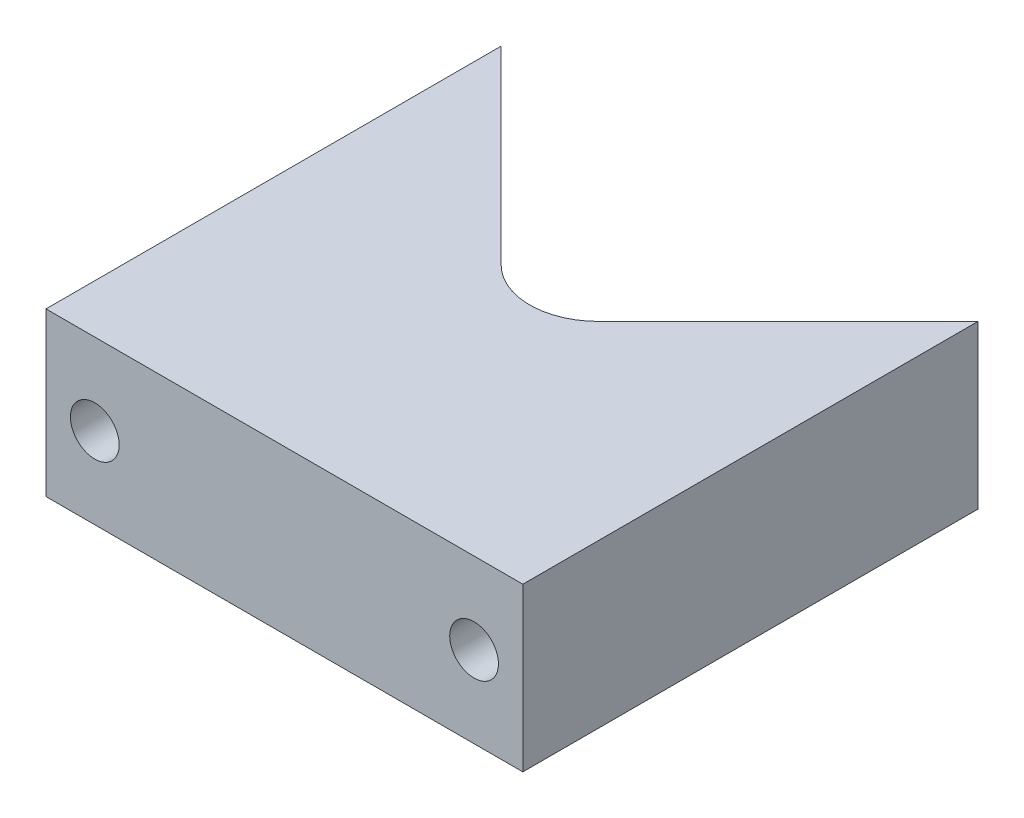
ISO-10303-21;
HEADER;
FILE_DESCRIPTION(('STEP AP214'),'2;1');
FILE_NAME('part.step','',(''),(''),'','','');
FILE_SCHEMA(('AUTOMOTIVE_DESIGN { 1 0 10303 214 1 1 1 1 }'));
ENDSEC;
DATA;
#1=APPLICATION_CONTEXT('core data for automotive mechanical design processes');
#2=APPLICATION_PROTOCOL_DEFINITION('international standard','automotive_design',2000,#1);
#3=PRODUCT_CONTEXT('',#1,'mechanical');
#4=PRODUCT('Part','Part','',(#3));
#5=PRODUCT_RELATED_PRODUCT_CATEGORY('part','',(#4));
#6=PRODUCT_DEFINITION_FORMATION('','',#4);
#7=PRODUCT_DEFINITION_CONTEXT('part definition',#1,'design');
#8=PRODUCT_DEFINITION('design','',#6,#7);
#9=PRODUCT_DEFINITION_SHAPE('','',#8);
#10=(LENGTH_UNIT() NAMED_UNIT(*) SI_UNIT(.MILLI.,.METRE.));
#11=(NAMED_UNIT(*) PLANE_ANGLE_UNIT() SI_UNIT($,.RADIAN.));
#12=(NAMED_UNIT(*) SI_UNIT($,.STERADIAN.) SOLID_ANGLE_UNIT());
#13=UNCERTAINTY_MEASURE_WITH_UNIT(LENGTH_MEASURE(1.E-05),#10,'distance_accuracy_value','');
#14=(GEOMETRIC_REPRESENTATION_CONTEXT(3) GLOBAL_UNCERTAINTY_ASSIGNED_CONTEXT((#13)) GLOBAL_UNIT_ASSIGNED_CONTEXT((#10,
#11,#12)) REPRESENTATION_CONTEXT('',''));
#15=CARTESIAN_POINT('',(0.,0.,0.));
#16=DIRECTION('',(0.,0.,1.));
#17=DIRECTION('',(1.,0.,0.));
#18=AXIS2_PLACEMENT_3D('',#15,#16,#17);
#19=CARTESIAN_POINT('',(44.,15.,0.));
#20=DIRECTION('',(0.,0.,-1.));
#21=DIRECTION('',(-1.,0.,0.));
#22=AXIS2_PLACEMENT_3D('',#19,#20,#21);
#23=PLANE('',#22);
#24=CARTESIAN_POINT('',(39.5,7.5,0.));
#25=DIRECTION('',(0.,0.,-1.));
#26=DIRECTION('',(-1.,0.,0.));
#27=AXIS2_PLACEMENT_3D('',#24,#25,#26);
#28=CIRCLE('',#27,2.25);
#29=CARTESIAN_POINT('',(37.25,7.5,0.));
#30=VERTEX_POINT('',#29);
#31=EDGE_CURVE('E128',#30,#30,#28,.T.);
#32=ORIENTED_EDGE('',*,*,#31,.T.);
#33=EDGE_LOOP('',(#32));
#34=FACE_BOUND('',#33,.T.);
#35=CARTESIAN_POINT('',(4.5,7.5,2.77555756156289E-13));
#36=DIRECTION('',(0.,0.,-1.));
#37=DIRECTION('',(-1.,0.,0.));
#38=AXIS2_PLACEMENT_3D('',#35,#36,#37);
#39=CIRCLE('',#38,2.25);
#40=CARTESIAN_POINT('',(2.25,7.5,2.77555756156289E-13));
#41=VERTEX_POINT('',#40);
#42=EDGE_CURVE('E151',#41,#41,#39,.T.);
#43=ORIENTED_EDGE('',*,*,#42,.T.);
#44=EDGE_LOOP('',(#43));
#45=FACE_BOUND('',#44,.T.);
#46=DIRECTION('',(1.,0.,0.));
#47=VECTOR('',#46,1.);
#48=CARTESIAN_POINT('',(44.,0.,0.));
#49=LINE('',#48,#47);
#50=CARTESIAN_POINT('',(0.,0.,0.));
#51=VERTEX_POINT('',#50);
#52=CARTESIAN_POINT('',(44.,0.,0.));
#53=VERTEX_POINT('',#52);
#54=EDGE_CURVE('E116',#51,#53,#49,.T.);
#55=ORIENTED_EDGE('',*,*,#54,.T.);
#56=DIRECTION('',(0.,-1.,0.));
#57=VECTOR('',#56,1.);
#58=CARTESIAN_POINT('',(44.,15.,0.));
#59=LINE('',#58,#57);
#60=CARTESIAN_POINT('',(44.,15.,0.));
#61=VERTEX_POINT('',#60);
#62=EDGE_CURVE('E98',#61,#53,#59,.T.);
#63=ORIENTED_EDGE('',*,*,#62,.F.);
#64=DIRECTION('',(1.,0.,0.));
#65=VECTOR('',#64,1.);
#66=CARTESIAN_POINT('',(44.,15.,0.));
#67=LINE('',#66,#65);
#68=CARTESIAN_POINT('',(0.,15.,0.));
#69=VERTEX_POINT('',#68);
#70=EDGE_CURVE('E104',#69,#61,#67,.T.);
#71=ORIENTED_EDGE('',*,*,#70,.F.);
#72=DIRECTION('',(0.,-1.,0.));
#73=VECTOR('',#72,1.);
#74=CARTESIAN_POINT('',(0.,15.,0.));
#75=LINE('',#74,#73);
#76=EDGE_CURVE('E158',#69,#51,#75,.T.);
#77=ORIENTED_EDGE('',*,*,#76,.T.);
#78=EDGE_LOOP('',(#55,#63,#71,#77));
#79=FACE_BOUND('',#78,.T.);
#80=ADVANCED_FACE('F41',(#34,#45,#79),#23,.F.);
#81=CARTESIAN_POINT('',(44.,15.,-42.));
#82=DIRECTION('',(-1.,0.,0.));
#83=DIRECTION('',(0.,0.,1.));
#84=AXIS2_PLACEMENT_3D('',#81,#82,#83);
#85=PLANE('',#84);
#86=DIRECTION('',(0.,0.,-1.));
#87=VECTOR('',#86,1.);
#88=CARTESIAN_POINT('',(44.,0.,-42.));
#89=LINE('',#88,#87);
#90=CARTESIAN_POINT('',(44.,0.,-42.));
#91=VERTEX_POINT('',#90);
#92=EDGE_CURVE('E160',#53,#91,#89,.T.);
#93=ORIENTED_EDGE('',*,*,#92,.T.);
#94=DIRECTION('',(0.,-1.,0.));
#95=VECTOR('',#94,1.);
#96=CARTESIAN_POINT('',(44.,15.,-42.));
#97=LINE('',#96,#95);
#98=CARTESIAN_POINT('',(44.,15.,-42.));
#99=VERTEX_POINT('',#98);
#100=EDGE_CURVE('E101',#99,#91,#97,.T.);
#101=ORIENTED_EDGE('',*,*,#100,.F.);
#102=DIRECTION('',(0.,0.,-1.));
#103=VECTOR('',#102,1.);
#104=CARTESIAN_POINT('',(44.,15.,-42.));
#105=LINE('',#104,#103);
#106=EDGE_CURVE('E94',#61,#99,#105,.T.);
#107=ORIENTED_EDGE('',*,*,#106,.F.);
#108=ORIENTED_EDGE('',*,*,#62,.T.);
#109=EDGE_LOOP('',(#93,#101,#107,#108));
#110=FACE_BOUND('',#109,.T.);
#111=ADVANCED_FACE('F96',(#110),#85,.F.);
#112=CARTESIAN_POINT('',(22.,15.,-19.9999999999999));
#113=DIRECTION('',(0.707106781186549,0.,0.707106781186546));
#114=DIRECTION('',(0.707106781186546,0.,-0.707106781186549));
#115=AXIS2_PLACEMENT_3D('',#112,#113,#114);
#116=PLANE('',#115);
#117=CARTESIAN_POINT('',(39.5,7.5,-37.5));
#118=DIRECTION('',(0.707106781186549,0.,0.707106781186546));
#119=DIRECTION('',(-0.707106781186546,0.,0.707106781186549));
#120=AXIS2_PLACEMENT_3D('',#117,#118,#119);
#121=ELLIPSE('',#120,5.30330085889911,3.75);
#122=CARTESIAN_POINT('',(35.75,7.5,-33.75));
#123=VERTEX_POINT('',#122);
#124=EDGE_CURVE('E130',#123,#123,#121,.T.);
#125=ORIENTED_EDGE('',*,*,#124,.T.);
#126=EDGE_LOOP('',(#125));
#127=FACE_BOUND('',#126,.T.);
#128=DIRECTION('',(-0.707106781186546,0.,0.707106781186549));
#129=VECTOR('',#128,1.);
#130=CARTESIAN_POINT('',(22.,0.,-19.9999999999999));
#131=LINE('',#130,#129);
#132=CARTESIAN_POINT('',(26.4901280605346,0.,-24.4901280605345));
#133=VERTEX_POINT('',#132);
#134=EDGE_CURVE('E162',#91,#133,#131,.T.);
#135=ORIENTED_EDGE('',*,*,#134,.T.);
#136=DIRECTION('',(0.,-1.,0.));
#137=VECTOR('',#136,1.);
#138=CARTESIAN_POINT('',(26.4901280605346,15.,-24.4901280605345));
#139=LINE('',#138,#137);
#140=CARTESIAN_POINT('',(26.4901280605346,15.,-24.4901280605345));
#141=VERTEX_POINT('',#140);
#142=EDGE_CURVE('E56',#133,#141,#139,.F.);
#143=ORIENTED_EDGE('',*,*,#142,.T.);
#144=DIRECTION('',(-0.707106781186546,0.,0.707106781186549));
#145=VECTOR('',#144,1.);
#146=CARTESIAN_POINT('',(22.,15.,-19.9999999999999));
#147=LINE('',#146,#145);
#148=EDGE_CURVE('E103',#99,#141,#147,.T.);
#149=ORIENTED_EDGE('',*,*,#148,.F.);
#150=ORIENTED_EDGE('',*,*,#100,.T.);
#151=EDGE_LOOP('',(#135,#143,#149,#150));
#152=FACE_BOUND('',#151,.T.);
#153=ADVANCED_FACE('F175',(#127,#152),#116,.F.);
#154=CARTESIAN_POINT('',(0.,15.,-42.));
#155=DIRECTION('',(-0.707106781186549,0.,0.707106781186546));
#156=DIRECTION('',(0.707106781186546,0.,0.707106781186549));
#157=AXIS2_PLACEMENT_3D('',#154,#155,#156);
#158=PLANE('',#157);
#159=CARTESIAN_POINT('',(4.5,7.5,-37.5));
#160=DIRECTION('',(-0.707106781186549,0.,0.707106781186546));
#161=DIRECTION('',(0.707106781186546,0.,0.707106781186549));
#162=AXIS2_PLACEMENT_3D('',#159,#160,#161);
#163=ELLIPSE('',#162,5.30330085889911,3.75);
#164=CARTESIAN_POINT('',(8.24999999999999,7.5,-33.75));
#165=VERTEX_POINT('',#164);
#166=EDGE_CURVE('E125',#165,#165,#163,.T.);
#167=ORIENTED_EDGE('',*,*,#166,.T.);
#168=EDGE_LOOP('',(#167));
#169=FACE_BOUND('',#168,.T.);
#170=DIRECTION('',(-0.707106781186546,0.,-0.707106781186549));
#171=VECTOR('',#170,1.);
#172=CARTESIAN_POINT('',(0.,15.,-42.));
#173=LINE('',#172,#171);
#174=CARTESIAN_POINT('',(17.5098719394654,15.,-24.4901280605345));
#175=VERTEX_POINT('',#174);
#176=CARTESIAN_POINT('',(0.,15.,-42.));
#177=VERTEX_POINT('',#176);
#178=EDGE_CURVE('E155',#175,#177,#173,.T.);
#179=ORIENTED_EDGE('',*,*,#178,.F.);
#180=DIRECTION('',(0.,-1.,0.));
#181=VECTOR('',#180,1.);
#182=CARTESIAN_POINT('',(17.5098719394654,0.,-24.4901280605345));
#183=LINE('',#182,#181);
#184=CARTESIAN_POINT('',(17.5098719394654,0.,-24.4901280605345));
#185=VERTEX_POINT('',#184);
#186=EDGE_CURVE('E117',#175,#185,#183,.T.);
#187=ORIENTED_EDGE('',*,*,#186,.T.);
#188=DIRECTION('',(-0.707106781186546,0.,-0.707106781186549));
#189=VECTOR('',#188,1.);
#190=CARTESIAN_POINT('',(0.,0.,-42.));
#191=LINE('',#190,#189);
#192=CARTESIAN_POINT('',(0.,0.,-42.));
#193=VERTEX_POINT('',#192);
#194=EDGE_CURVE('E164',#185,#193,#191,.T.);
#195=ORIENTED_EDGE('',*,*,#194,.T.);
#196=DIRECTION('',(0.,-1.,0.));
#197=VECTOR('',#196,1.);
#198=CARTESIAN_POINT('',(0.,15.,-42.));
#199=LINE('',#198,#197);
#200=EDGE_CURVE('E121',#177,#193,#199,.T.);
#201=ORIENTED_EDGE('',*,*,#200,.F.);
#202=EDGE_LOOP('',(#179,#187,#195,#201));
#203=FACE_BOUND('',#202,.T.);
#204=ADVANCED_FACE('F179',(#169,#203),#158,.F.);
#205=CARTESIAN_POINT('',(0.,15.,0.));
#206=DIRECTION('',(1.,0.,0.));
#207=DIRECTION('',(0.,0.,-1.));
#208=AXIS2_PLACEMENT_3D('',#205,#206,#207);
#209=PLANE('',#208);
#210=DIRECTION('',(0.,0.,1.));
#211=VECTOR('',#210,1.);
#212=CARTESIAN_POINT('',(0.,0.,0.));
#213=LINE('',#212,#211);
#214=EDGE_CURVE('E113',#193,#51,#213,.T.);
#215=ORIENTED_EDGE('',*,*,#214,.T.);
#216=ORIENTED_EDGE('',*,*,#76,.F.);
#217=DIRECTION('',(0.,0.,1.));
#218=VECTOR('',#217,1.);
#219=CARTESIAN_POINT('',(0.,15.,0.));
#220=LINE('',#219,#218);
#221=EDGE_CURVE('E109',#177,#69,#220,.T.);
#222=ORIENTED_EDGE('',*,*,#221,.F.);
#223=ORIENTED_EDGE('',*,*,#200,.T.);
#224=EDGE_LOOP('',(#215,#216,#222,#223));
#225=FACE_BOUND('',#224,.T.);
#226=ADVANCED_FACE('F171',(#225),#209,.F.);
#227=CARTESIAN_POINT('',(0.,15.,0.));
#228=DIRECTION('',(0.,-1.,0.));
#229=DIRECTION('',(0.,0.,-1.));
#230=AXIS2_PLACEMENT_3D('',#227,#228,#229);
#231=PLANE('',#230);
#232=ORIENTED_EDGE('',*,*,#70,.T.);
#233=ORIENTED_EDGE('',*,*,#106,.T.);
#234=ORIENTED_EDGE('',*,*,#148,.T.);
#235=CARTESIAN_POINT('',(22.,15.,-28.9802561210691));
#236=DIRECTION('',(0.,-1.,0.));
#237=DIRECTION('',(0.,0.,-1.));
#238=AXIS2_PLACEMENT_3D('',#235,#236,#237);
#239=CIRCLE('',#238,6.35);
#240=EDGE_CURVE('E11',#141,#175,#239,.T.);
#241=ORIENTED_EDGE('',*,*,#240,.T.);
#242=ORIENTED_EDGE('',*,*,#178,.T.);
#243=ORIENTED_EDGE('',*,*,#221,.T.);
#244=EDGE_LOOP('',(#232,#233,#234,#241,#242,#243));
#245=FACE_BOUND('',#244,.T.);
#246=ADVANCED_FACE('F107',(#245),#231,.F.);
#247=CARTESIAN_POINT('',(0.,0.,0.));
#248=DIRECTION('',(0.,-1.,0.));
#249=DIRECTION('',(0.,0.,-1.));
#250=AXIS2_PLACEMENT_3D('',#247,#248,#249);
#251=PLANE('',#250);
#252=ORIENTED_EDGE('',*,*,#54,.F.);
#253=ORIENTED_EDGE('',*,*,#214,.F.);
#254=ORIENTED_EDGE('',*,*,#194,.F.);
#255=CARTESIAN_POINT('',(22.,0.,-28.9802561210691));
#256=DIRECTION('',(0.,-1.,0.));
#257=DIRECTION('',(0.,0.,-1.));
#258=AXIS2_PLACEMENT_3D('',#255,#256,#257);
#259=CIRCLE('',#258,6.35);
#260=EDGE_CURVE('E49',#185,#133,#259,.F.);
#261=ORIENTED_EDGE('',*,*,#260,.T.);
#262=ORIENTED_EDGE('',*,*,#134,.F.);
#263=ORIENTED_EDGE('',*,*,#92,.F.);
#264=EDGE_LOOP('',(#252,#253,#254,#261,#262,#263));
#265=FACE_BOUND('',#264,.T.);
#266=ADVANCED_FACE('F174',(#265),#251,.T.);
#267=CARTESIAN_POINT('',(4.5,7.5,-12.7));
#268=DIRECTION('',(0.,0.,-1.));
#269=DIRECTION('',(-1.,0.,0.));
#270=AXIS2_PLACEMENT_3D('',#267,#268,#269);
#271=CYLINDRICAL_SURFACE('',#270,2.25);
#272=ORIENTED_EDGE('',*,*,#42,.F.);
#273=EDGE_LOOP('',(#272));
#274=FACE_BOUND('',#273,.T.);
#275=CARTESIAN_POINT('',(4.5,7.5,-12.7));
#276=DIRECTION('',(0.,0.,1.));
#277=DIRECTION('',(1.,0.,0.));
#278=AXIS2_PLACEMENT_3D('',#275,#276,#277);
#279=CIRCLE('',#278,2.25);
#280=CARTESIAN_POINT('',(6.74999999999999,7.5,-12.7));
#281=VERTEX_POINT('',#280);
#282=EDGE_CURVE('E129',#281,#281,#279,.F.);
#283=ORIENTED_EDGE('',*,*,#282,.T.);
#284=EDGE_LOOP('',(#283));
#285=FACE_BOUND('',#284,.T.);
#286=ADVANCED_FACE('F199',(#274,#285),#271,.F.);
#287=CARTESIAN_POINT('',(39.5,7.5,-12.7000000000003));
#288=DIRECTION('',(0.,0.,-1.));
#289=DIRECTION('',(-1.,0.,0.));
#290=AXIS2_PLACEMENT_3D('',#287,#288,#289);
#291=CYLINDRICAL_SURFACE('',#290,2.25);
#292=ORIENTED_EDGE('',*,*,#31,.F.);
#293=EDGE_LOOP('',(#292));
#294=FACE_BOUND('',#293,.T.);
#295=CARTESIAN_POINT('',(39.5,7.5,-12.7000000000003));
#296=DIRECTION('',(0.,0.,1.));
#297=DIRECTION('',(1.,0.,0.));
#298=AXIS2_PLACEMENT_3D('',#295,#296,#297);
#299=CIRCLE('',#298,2.25);
#300=CARTESIAN_POINT('',(41.75,7.5,-12.7000000000003));
#301=VERTEX_POINT('',#300);
#302=EDGE_CURVE('E133',#301,#301,#299,.F.);
#303=ORIENTED_EDGE('',*,*,#302,.T.);
#304=EDGE_LOOP('',(#303));
#305=FACE_BOUND('',#304,.T.);
#306=ADVANCED_FACE('F202',(#294,#305),#291,.F.);
#307=CARTESIAN_POINT('',(4.5,7.5,-12.7));
#308=DIRECTION('',(0.,0.,1.));
#309=DIRECTION('',(1.,0.,0.));
#310=AXIS2_PLACEMENT_3D('',#307,#308,#309);
#311=CYLINDRICAL_SURFACE('',#310,3.75);
#312=CARTESIAN_POINT('',(4.5,7.5,-12.7));
#313=DIRECTION('',(0.,0.,1.));
#314=DIRECTION('',(1.,0.,0.));
#315=AXIS2_PLACEMENT_3D('',#312,#313,#314);
#316=CIRCLE('',#315,3.75);
#317=CARTESIAN_POINT('',(8.24999999999999,7.5,-12.7));
#318=VERTEX_POINT('',#317);
#319=EDGE_CURVE('E132',#318,#318,#316,.T.);
#320=ORIENTED_EDGE('',*,*,#319,.T.);
#321=EDGE_LOOP('',(#320));
#322=FACE_BOUND('',#321,.T.);
#323=ORIENTED_EDGE('',*,*,#166,.F.);
#324=EDGE_LOOP('',(#323));
#325=FACE_BOUND('',#324,.T.);
#326=ADVANCED_FACE('F209',(#322,#325),#311,.F.);
#327=CARTESIAN_POINT('',(8.24999999999999,7.5,-12.7));
#328=DIRECTION('',(0.,0.,1.));
#329=DIRECTION('',(1.,0.,0.));
#330=AXIS2_PLACEMENT_3D('',#327,#328,#329);
#331=PLANE('',#330);
#332=ORIENTED_EDGE('',*,*,#319,.F.);
#333=EDGE_LOOP('',(#332));
#334=FACE_BOUND('',#333,.T.);
#335=ORIENTED_EDGE('',*,*,#282,.F.);
#336=EDGE_LOOP('',(#335));
#337=FACE_BOUND('',#336,.T.);
#338=ADVANCED_FACE('F206',(#334,#337),#331,.F.);
#339=CARTESIAN_POINT('',(39.5,7.5,-12.7000000000003));
#340=DIRECTION('',(0.,0.,1.));
#341=DIRECTION('',(1.,0.,0.));
#342=AXIS2_PLACEMENT_3D('',#339,#340,#341);
#343=CYLINDRICAL_SURFACE('',#342,3.75);
#344=CARTESIAN_POINT('',(39.5,7.5,-12.7000000000003));
#345=DIRECTION('',(0.,0.,1.));
#346=DIRECTION('',(1.,0.,0.));
#347=AXIS2_PLACEMENT_3D('',#344,#345,#346);
#348=CIRCLE('',#347,3.75);
#349=CARTESIAN_POINT('',(43.25,7.5,-12.7000000000003));
#350=VERTEX_POINT('',#349);
#351=EDGE_CURVE('E140',#350,#350,#348,.T.);
#352=ORIENTED_EDGE('',*,*,#351,.T.);
#353=EDGE_LOOP('',(#352));
#354=FACE_BOUND('',#353,.T.);
#355=ORIENTED_EDGE('',*,*,#124,.F.);
#356=EDGE_LOOP('',(#355));
#357=FACE_BOUND('',#356,.T.);
#358=ADVANCED_FACE('F208',(#354,#357),#343,.F.);
#359=CARTESIAN_POINT('',(43.25,7.5,-12.7000000000003));
#360=DIRECTION('',(0.,0.,1.));
#361=DIRECTION('',(1.,0.,0.));
#362=AXIS2_PLACEMENT_3D('',#359,#360,#361);
#363=PLANE('',#362);
#364=ORIENTED_EDGE('',*,*,#351,.F.);
#365=EDGE_LOOP('',(#364));
#366=FACE_BOUND('',#365,.T.);
#367=ORIENTED_EDGE('',*,*,#302,.F.);
#368=EDGE_LOOP('',(#367));
#369=FACE_BOUND('',#368,.T.);
#370=ADVANCED_FACE('F216',(#366,#369),#363,.F.);
#371=CARTESIAN_POINT('',(22.,15.,-28.9802561210691));
#372=DIRECTION('',(0.,1.,0.));
#373=DIRECTION('',(0.,0.,1.));
#374=AXIS2_PLACEMENT_3D('',#371,#372,#373);
#375=CYLINDRICAL_SURFACE('',#374,6.35);
#376=ORIENTED_EDGE('',*,*,#240,.F.);
#377=ORIENTED_EDGE('',*,*,#142,.F.);
#378=ORIENTED_EDGE('',*,*,#260,.F.);
#379=ORIENTED_EDGE('',*,*,#186,.F.);
#380=EDGE_LOOP('',(#376,#377,#378,#379));
#381=FACE_BOUND('',#380,.T.);
#382=ADVANCED_FACE('F43',(#381),#375,.F.);
#383=CLOSED_SHELL('',(#80,#111,#153,#204,#226,#246,#266,#286,#306,#326,#338,#358,#370,#382));
#384=MANIFOLD_SOLID_BREP('B2',#383);
#385=ADVANCED_BREP_SHAPE_REPRESENTATION('',(#18,#384),#14);
#386=SHAPE_DEFINITION_REPRESENTATION(#9,#385);
ENDSEC;
END-ISO-10303-21;
